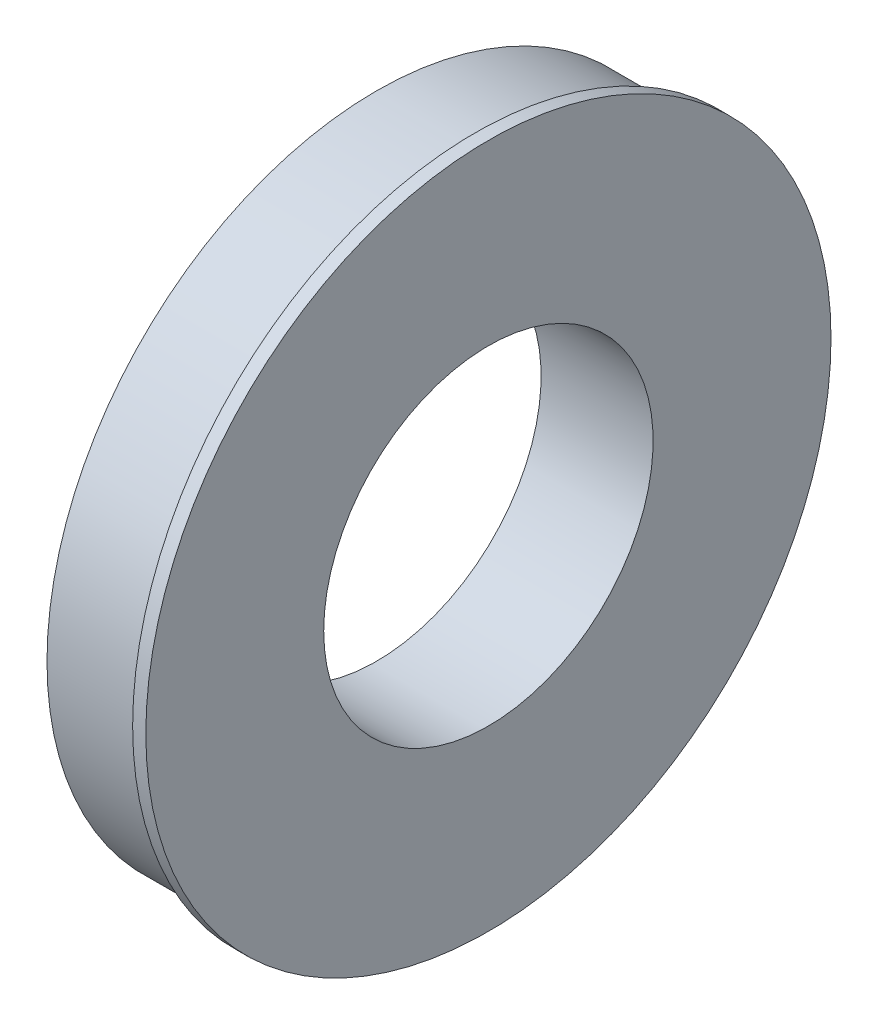
ISO-10303-21;
HEADER;
FILE_DESCRIPTION(('STEP AP214'),'2;1');
FILE_NAME('part.step','',(''),(''),'','','');
FILE_SCHEMA(('AUTOMOTIVE_DESIGN { 1 0 10303 214 1 1 1 1 }'));
ENDSEC;
DATA;
#1=APPLICATION_CONTEXT('core data for automotive mechanical design processes');
#2=APPLICATION_PROTOCOL_DEFINITION('international standard','automotive_design',2000,#1);
#3=PRODUCT_CONTEXT('',#1,'mechanical');
#4=PRODUCT('Part','Part','',(#3));
#5=PRODUCT_RELATED_PRODUCT_CATEGORY('part','',(#4));
#6=PRODUCT_DEFINITION_FORMATION('','',#4);
#7=PRODUCT_DEFINITION_CONTEXT('part definition',#1,'design');
#8=PRODUCT_DEFINITION('design','',#6,#7);
#9=PRODUCT_DEFINITION_SHAPE('','',#8);
#10=(LENGTH_UNIT() NAMED_UNIT(*) SI_UNIT(.MILLI.,.METRE.));
#11=(NAMED_UNIT(*) PLANE_ANGLE_UNIT() SI_UNIT($,.RADIAN.));
#12=(NAMED_UNIT(*) SI_UNIT($,.STERADIAN.) SOLID_ANGLE_UNIT());
#13=UNCERTAINTY_MEASURE_WITH_UNIT(LENGTH_MEASURE(1.E-05),#10,'distance_accuracy_value','');
#14=(GEOMETRIC_REPRESENTATION_CONTEXT(3) GLOBAL_UNCERTAINTY_ASSIGNED_CONTEXT((#13)) GLOBAL_UNIT_ASSIGNED_CONTEXT((#10,
#11,#12)) REPRESENTATION_CONTEXT('',''));
#15=CARTESIAN_POINT('',(0.,0.,0.));
#16=DIRECTION('',(0.,0.,1.));
#17=DIRECTION('',(1.,0.,0.));
#18=AXIS2_PLACEMENT_3D('',#15,#16,#17);
#19=CARTESIAN_POINT('',(0.,0.,0.));
#20=DIRECTION('',(1.,0.,0.));
#21=DIRECTION('',(0.,0.,-1.));
#22=AXIS2_PLACEMENT_3D('',#19,#20,#21);
#23=PLANE('',#22);
#24=CARTESIAN_POINT('',(0.,0.,0.));
#25=DIRECTION('',(1.,0.,0.));
#26=DIRECTION('',(0.,0.,-1.));
#27=AXIS2_PLACEMENT_3D('',#24,#25,#26);
#28=CIRCLE('',#27,63.5);
#29=CARTESIAN_POINT('',(0.,0.,63.5));
#30=VERTEX_POINT('',#29);
#31=EDGE_CURVE('E36',#30,#30,#28,.T.);
#32=ORIENTED_EDGE('',*,*,#31,.F.);
#33=EDGE_LOOP('',(#32));
#34=FACE_BOUND('',#33,.T.);
#35=CARTESIAN_POINT('',(0.,0.,0.));
#36=DIRECTION('',(1.,0.,0.));
#37=DIRECTION('',(0.,0.,-1.));
#38=AXIS2_PLACEMENT_3D('',#35,#36,#37);
#39=CIRCLE('',#38,31.75);
#40=CARTESIAN_POINT('',(0.,0.,31.75));
#41=VERTEX_POINT('',#40);
#42=EDGE_CURVE('E43',#41,#41,#39,.T.);
#43=ORIENTED_EDGE('',*,*,#42,.T.);
#44=EDGE_LOOP('',(#43));
#45=FACE_BOUND('',#44,.T.);
#46=ADVANCED_FACE('F32',(#34,#45),#23,.F.);
#47=CARTESIAN_POINT('',(19.05,0.,0.));
#48=DIRECTION('',(-1.,0.,0.));
#49=DIRECTION('',(0.,0.,1.));
#50=AXIS2_PLACEMENT_3D('',#47,#48,#49);
#51=CYLINDRICAL_SURFACE('',#50,63.5);
#52=CARTESIAN_POINT('',(19.05,0.,0.));
#53=DIRECTION('',(1.,0.,0.));
#54=DIRECTION('',(0.,0.,-1.));
#55=AXIS2_PLACEMENT_3D('',#52,#53,#54);
#56=CIRCLE('',#55,63.5);
#57=CARTESIAN_POINT('',(19.05,0.,63.5));
#58=VERTEX_POINT('',#57);
#59=EDGE_CURVE('E10',#58,#58,#56,.T.);
#60=CARTESIAN_POINT('',(19.05,0.,63.5));
#61=CARTESIAN_POINT('',(18.8515625,0.,63.5));
#62=CARTESIAN_POINT('',(18.653125,0.,63.5));
#63=CARTESIAN_POINT('',(18.25625,0.,63.5));
#64=CARTESIAN_POINT('',(18.0578125,0.,63.5));
#65=CARTESIAN_POINT('',(17.6609375,0.,63.5));
#66=CARTESIAN_POINT('',(17.4625,0.,63.5));
#67=CARTESIAN_POINT('',(17.065625,0.,63.5));
#68=CARTESIAN_POINT('',(16.8671875,0.,63.5));
#69=CARTESIAN_POINT('',(16.4703125,0.,63.5));
#70=CARTESIAN_POINT('',(16.271875,0.,63.5));
#71=CARTESIAN_POINT('',(15.875,0.,63.5));
#72=CARTESIAN_POINT('',(15.6765625,0.,63.5));
#73=CARTESIAN_POINT('',(15.2796875,0.,63.5));
#74=CARTESIAN_POINT('',(15.08125,0.,63.5));
#75=CARTESIAN_POINT('',(14.684375,0.,63.5));
#76=CARTESIAN_POINT('',(14.4859375,0.,63.5));
#77=CARTESIAN_POINT('',(14.0890625,0.,63.5));
#78=CARTESIAN_POINT('',(13.890625,0.,63.5));
#79=CARTESIAN_POINT('',(13.49375,0.,63.5));
#80=CARTESIAN_POINT('',(13.2953125,0.,63.5));
#81=CARTESIAN_POINT('',(12.8984375,0.,63.5));
#82=CARTESIAN_POINT('',(12.7,0.,63.5));
#83=CARTESIAN_POINT('',(12.303125,0.,63.5));
#84=CARTESIAN_POINT('',(12.1046875,0.,63.5));
#85=CARTESIAN_POINT('',(11.7078125,0.,63.5));
#86=CARTESIAN_POINT('',(11.509375,0.,63.5));
#87=CARTESIAN_POINT('',(11.1125,0.,63.5));
#88=CARTESIAN_POINT('',(10.9140625,0.,63.5));
#89=CARTESIAN_POINT('',(10.5171875,0.,63.5));
#90=CARTESIAN_POINT('',(10.31875,0.,63.5));
#91=CARTESIAN_POINT('',(9.921875,0.,63.5));
#92=CARTESIAN_POINT('',(9.7234375,0.,63.5));
#93=CARTESIAN_POINT('',(9.3265625,0.,63.5));
#94=CARTESIAN_POINT('',(9.128125,0.,63.5));
#95=CARTESIAN_POINT('',(8.73125,0.,63.5));
#96=CARTESIAN_POINT('',(8.5328125,0.,63.5));
#97=CARTESIAN_POINT('',(8.1359375,0.,63.5));
#98=CARTESIAN_POINT('',(7.9375,0.,63.5));
#99=CARTESIAN_POINT('',(7.540625,0.,63.5));
#100=CARTESIAN_POINT('',(7.3421875,0.,63.5));
#101=CARTESIAN_POINT('',(6.9453125,0.,63.5));
#102=CARTESIAN_POINT('',(6.746875,0.,63.5));
#103=CARTESIAN_POINT('',(6.35,0.,63.5));
#104=CARTESIAN_POINT('',(6.1515625,0.,63.5));
#105=CARTESIAN_POINT('',(5.7546875,0.,63.5));
#106=CARTESIAN_POINT('',(5.55625,0.,63.5));
#107=CARTESIAN_POINT('',(5.159375,0.,63.5));
#108=CARTESIAN_POINT('',(4.9609375,0.,63.5));
#109=CARTESIAN_POINT('',(4.5640625,0.,63.5));
#110=CARTESIAN_POINT('',(4.365625,0.,63.5));
#111=CARTESIAN_POINT('',(3.96875,0.,63.5));
#112=CARTESIAN_POINT('',(3.7703125,0.,63.5));
#113=CARTESIAN_POINT('',(3.3734375,0.,63.5));
#114=CARTESIAN_POINT('',(3.175,0.,63.5));
#115=CARTESIAN_POINT('',(2.778125,0.,63.5));
#116=CARTESIAN_POINT('',(2.5796875,0.,63.5));
#117=CARTESIAN_POINT('',(2.1828125,0.,63.5));
#118=CARTESIAN_POINT('',(1.984375,0.,63.5));
#119=CARTESIAN_POINT('',(1.5875,0.,63.5));
#120=CARTESIAN_POINT('',(1.3890625,0.,63.5));
#121=CARTESIAN_POINT('',(0.992187500000001,0.,63.5));
#122=CARTESIAN_POINT('',(0.793750000000001,0.,63.5));
#123=CARTESIAN_POINT('',(0.396875,0.,63.5));
#124=CARTESIAN_POINT('',(0.1984375,0.,63.5));
#125=CARTESIAN_POINT('',(0.,0.,63.5));
#126=B_SPLINE_CURVE_WITH_KNOTS('',3,(#60,#61,#62,#63,#64,#65,#66,#67,#68,#69,#70,#71,#72,#73,
#74,#75,#76,#77,#78,#79,#80,#81,#82,#83,#84,#85,#86,#87,#88,#89,#90,#91,#92,#93,#94,#95,#96,#97,
#98,#99,#100,#101,#102,#103,#104,#105,#106,#107,#108,#109,#110,#111,#112,#113,#114,#115,#116,
#117,#118,#119,#120,#121,#122,#123,#124,#125),.UNSPECIFIED.,.F.,.F.,(4,2,2,2,2,2,2,2,2,2,2,2,2,
2,2,2,2,2,2,2,2,2,2,2,2,2,2,2,2,2,2,2,4),(0.,0.5953125,1.190625,1.7859375,2.38125,2.9765625,
3.571875,4.1671875,4.7625,5.3578125,5.953125,6.5484375,7.14375,7.7390625,8.334375,8.9296875,
9.525,10.1203125,10.715625,11.3109375,11.90625,12.5015625,13.096875,13.6921875,14.2875,
14.8828125,15.478125,16.0734375,16.66875,17.2640625,17.859375,18.4546875,19.05),.UNSPECIFIED.);
#127=EDGE_CURVE('BSEAM34',#58,#30,#126,.T.);
#128=ORIENTED_EDGE('',*,*,#59,.F.);
#129=ORIENTED_EDGE('',*,*,#31,.T.);
#130=ORIENTED_EDGE('',*,*,#127,.T.);
#131=ORIENTED_EDGE('',*,*,#127,.F.);
#132=EDGE_LOOP('',(#128,#130,#129,#131));
#133=FACE_BOUND('',#132,.T.);
#134=ADVANCED_FACE('F34',(#133),#51,.T.);
#135=CARTESIAN_POINT('',(19.05,0.,0.));
#136=DIRECTION('',(-1.,0.,0.));
#137=DIRECTION('',(0.,0.,1.));
#138=AXIS2_PLACEMENT_3D('',#135,#136,#137);
#139=CYLINDRICAL_SURFACE('',#138,31.75);
#140=CARTESIAN_POINT('',(21.59,0.,0.));
#141=DIRECTION('',(1.,0.,0.));
#142=DIRECTION('',(0.,0.,-1.));
#143=AXIS2_PLACEMENT_3D('',#140,#141,#142);
#144=CIRCLE('',#143,31.75);
#145=CARTESIAN_POINT('',(21.59,0.,31.75));
#146=VERTEX_POINT('',#145);
#147=EDGE_CURVE('E51',#146,#146,#144,.T.);
#148=CARTESIAN_POINT('',(0.,0.,31.75));
#149=CARTESIAN_POINT('',(0.224895833333333,0.,31.75));
#150=CARTESIAN_POINT('',(0.449791666666667,0.,31.75));
#151=CARTESIAN_POINT('',(0.899583333333333,0.,31.75));
#152=CARTESIAN_POINT('',(1.12447916666667,0.,31.75));
#153=CARTESIAN_POINT('',(1.57427083333333,0.,31.75));
#154=CARTESIAN_POINT('',(1.79916666666667,0.,31.75));
#155=CARTESIAN_POINT('',(2.24895833333333,0.,31.75));
#156=CARTESIAN_POINT('',(2.47385416666667,0.,31.75));
#157=CARTESIAN_POINT('',(2.92364583333333,0.,31.75));
#158=CARTESIAN_POINT('',(3.14854166666667,0.,31.75));
#159=CARTESIAN_POINT('',(3.59833333333333,0.,31.75));
#160=CARTESIAN_POINT('',(3.82322916666667,0.,31.75));
#161=CARTESIAN_POINT('',(4.27302083333333,0.,31.75));
#162=CARTESIAN_POINT('',(4.49791666666667,0.,31.75));
#163=CARTESIAN_POINT('',(4.94770833333333,0.,31.75));
#164=CARTESIAN_POINT('',(5.17260416666667,0.,31.75));
#165=CARTESIAN_POINT('',(5.62239583333333,0.,31.75));
#166=CARTESIAN_POINT('',(5.84729166666667,0.,31.75));
#167=CARTESIAN_POINT('',(6.29708333333333,0.,31.75));
#168=CARTESIAN_POINT('',(6.52197916666667,0.,31.75));
#169=CARTESIAN_POINT('',(6.97177083333333,0.,31.75));
#170=CARTESIAN_POINT('',(7.19666666666667,0.,31.75));
#171=CARTESIAN_POINT('',(7.64645833333333,0.,31.75));
#172=CARTESIAN_POINT('',(7.87135416666667,0.,31.75));
#173=CARTESIAN_POINT('',(8.32114583333333,0.,31.75));
#174=CARTESIAN_POINT('',(8.54604166666667,0.,31.75));
#175=CARTESIAN_POINT('',(8.99583333333334,0.,31.75));
#176=CARTESIAN_POINT('',(9.22072916666667,0.,31.75));
#177=CARTESIAN_POINT('',(9.67052083333333,0.,31.75));
#178=CARTESIAN_POINT('',(9.89541666666667,0.,31.75));
#179=CARTESIAN_POINT('',(10.3452083333333,0.,31.75));
#180=CARTESIAN_POINT('',(10.5701041666667,0.,31.75));
#181=CARTESIAN_POINT('',(11.0198958333333,0.,31.75));
#182=CARTESIAN_POINT('',(11.2447916666667,0.,31.75));
#183=CARTESIAN_POINT('',(11.6945833333333,0.,31.75));
#184=CARTESIAN_POINT('',(11.9194791666667,0.,31.75));
#185=CARTESIAN_POINT('',(12.3692708333333,0.,31.75));
#186=CARTESIAN_POINT('',(12.5941666666667,0.,31.75));
#187=CARTESIAN_POINT('',(13.0439583333333,0.,31.75));
#188=CARTESIAN_POINT('',(13.2688541666667,0.,31.75));
#189=CARTESIAN_POINT('',(13.7186458333333,0.,31.75));
#190=CARTESIAN_POINT('',(13.9435416666667,0.,31.75));
#191=CARTESIAN_POINT('',(14.3933333333333,0.,31.75));
#192=CARTESIAN_POINT('',(14.6182291666667,0.,31.75));
#193=CARTESIAN_POINT('',(15.0680208333333,0.,31.75));
#194=CARTESIAN_POINT('',(15.2929166666667,0.,31.75));
#195=CARTESIAN_POINT('',(15.7427083333333,0.,31.75));
#196=CARTESIAN_POINT('',(15.9676041666667,0.,31.75));
#197=CARTESIAN_POINT('',(16.4173958333333,0.,31.75));
#198=CARTESIAN_POINT('',(16.6422916666667,0.,31.75));
#199=CARTESIAN_POINT('',(17.0920833333333,0.,31.75));
#200=CARTESIAN_POINT('',(17.3169791666667,0.,31.75));
#201=CARTESIAN_POINT('',(17.7667708333333,0.,31.75));
#202=CARTESIAN_POINT('',(17.9916666666667,0.,31.75));
#203=CARTESIAN_POINT('',(18.4414583333333,0.,31.75));
#204=CARTESIAN_POINT('',(18.6663541666667,0.,31.75));
#205=CARTESIAN_POINT('',(19.1161458333333,0.,31.75));
#206=CARTESIAN_POINT('',(19.3410416666667,0.,31.75));
#207=CARTESIAN_POINT('',(19.7908333333333,0.,31.75));
#208=CARTESIAN_POINT('',(20.0157291666667,0.,31.75));
#209=CARTESIAN_POINT('',(20.4655208333333,0.,31.75));
#210=CARTESIAN_POINT('',(20.6904166666667,0.,31.75));
#211=CARTESIAN_POINT('',(21.1402083333333,0.,31.75));
#212=CARTESIAN_POINT('',(21.3651041666667,0.,31.75));
#213=CARTESIAN_POINT('',(21.59,0.,31.75));
#214=B_SPLINE_CURVE_WITH_KNOTS('',3,(#148,#149,#150,#151,#152,#153,#154,#155,#156,#157,#158,
#159,#160,#161,#162,#163,#164,#165,#166,#167,#168,#169,#170,#171,#172,#173,#174,#175,#176,#177,
#178,#179,#180,#181,#182,#183,#184,#185,#186,#187,#188,#189,#190,#191,#192,#193,#194,#195,#196,
#197,#198,#199,#200,#201,#202,#203,#204,#205,#206,#207,#208,#209,#210,#211,#212,#213),
.UNSPECIFIED.,.F.,.F.,(4,2,2,2,2,2,2,2,2,2,2,2,2,2,2,2,2,2,2,2,2,2,2,2,2,2,2,2,2,2,2,2,4),(0.,
0.6746875,1.349375,2.0240625,2.69875,3.3734375,4.048125,4.7228125,5.3975,6.0721875,6.746875,
7.4215625,8.09625,8.7709375,9.445625,10.1203125,10.795,11.4696875,12.144375,12.8190625,13.49375,
14.1684375,14.843125,15.5178125,16.1925,16.8671875,17.541875,18.2165625,18.89125,19.5659375,
20.240625,20.9153125,21.59),.UNSPECIFIED.);
#215=EDGE_CURVE('BSEAM57',#41,#146,#214,.T.);
#216=ORIENTED_EDGE('',*,*,#42,.F.);
#217=ORIENTED_EDGE('',*,*,#147,.T.);
#218=ORIENTED_EDGE('',*,*,#215,.T.);
#219=ORIENTED_EDGE('',*,*,#215,.F.);
#220=EDGE_LOOP('',(#216,#218,#217,#219));
#221=FACE_BOUND('',#220,.T.);
#222=ADVANCED_FACE('F57',(#221),#139,.F.);
#223=CARTESIAN_POINT('',(21.59,0.,0.));
#224=DIRECTION('',(1.,0.,0.));
#225=DIRECTION('',(0.,0.,-1.));
#226=AXIS2_PLACEMENT_3D('',#223,#224,#225);
#227=PLANE('',#226);
#228=CARTESIAN_POINT('',(21.59,0.,0.));
#229=DIRECTION('',(1.,0.,0.));
#230=DIRECTION('',(0.,0.,-1.));
#231=AXIS2_PLACEMENT_3D('',#228,#229,#230);
#232=CIRCLE('',#231,66.04);
#233=CARTESIAN_POINT('',(21.59,0.,-66.04));
#234=VERTEX_POINT('',#233);
#235=EDGE_CURVE('E47',#234,#234,#232,.T.);
#236=ORIENTED_EDGE('',*,*,#235,.T.);
#237=EDGE_LOOP('',(#236));
#238=FACE_BOUND('',#237,.T.);
#239=ORIENTED_EDGE('',*,*,#147,.F.);
#240=EDGE_LOOP('',(#239));
#241=FACE_BOUND('',#240,.T.);
#242=ADVANCED_FACE('F59',(#238,#241),#227,.T.);
#243=CARTESIAN_POINT('',(19.05,0.,0.));
#244=DIRECTION('',(1.,0.,0.));
#245=DIRECTION('',(0.,0.,-1.));
#246=AXIS2_PLACEMENT_3D('',#243,#244,#245);
#247=PLANE('',#246);
#248=ORIENTED_EDGE('',*,*,#59,.T.);
#249=EDGE_LOOP('',(#248));
#250=FACE_BOUND('',#249,.T.);
#251=CARTESIAN_POINT('',(19.05,0.,0.));
#252=DIRECTION('',(1.,0.,0.));
#253=DIRECTION('',(0.,0.,-1.));
#254=AXIS2_PLACEMENT_3D('',#251,#252,#253);
#255=CIRCLE('',#254,66.04);
#256=CARTESIAN_POINT('',(19.05,0.,-66.04));
#257=VERTEX_POINT('',#256);
#258=EDGE_CURVE('E48',#257,#257,#255,.T.);
#259=ORIENTED_EDGE('',*,*,#258,.F.);
#260=EDGE_LOOP('',(#259));
#261=FACE_BOUND('',#260,.T.);
#262=ADVANCED_FACE('F61',(#250,#261),#247,.F.);
#263=CARTESIAN_POINT('',(21.59,0.,0.));
#264=DIRECTION('',(-1.,0.,0.));
#265=DIRECTION('',(0.,0.,1.));
#266=AXIS2_PLACEMENT_3D('',#263,#264,#265);
#267=CYLINDRICAL_SURFACE('',#266,66.04);
#268=ORIENTED_EDGE('',*,*,#235,.F.);
#269=EDGE_LOOP('',(#268));
#270=FACE_BOUND('',#269,.T.);
#271=ORIENTED_EDGE('',*,*,#258,.T.);
#272=EDGE_LOOP('',(#271));
#273=FACE_BOUND('',#272,.T.);
#274=ADVANCED_FACE('F68',(#270,#273),#267,.T.);
#275=CLOSED_SHELL('',(#46,#134,#222,#242,#262,#274));
#276=MANIFOLD_SOLID_BREP('B2',#275);
#277=ADVANCED_BREP_SHAPE_REPRESENTATION('',(#18,#276),#14);
#278=SHAPE_DEFINITION_REPRESENTATION(#9,#277);
ENDSEC;
END-ISO-10303-21;
